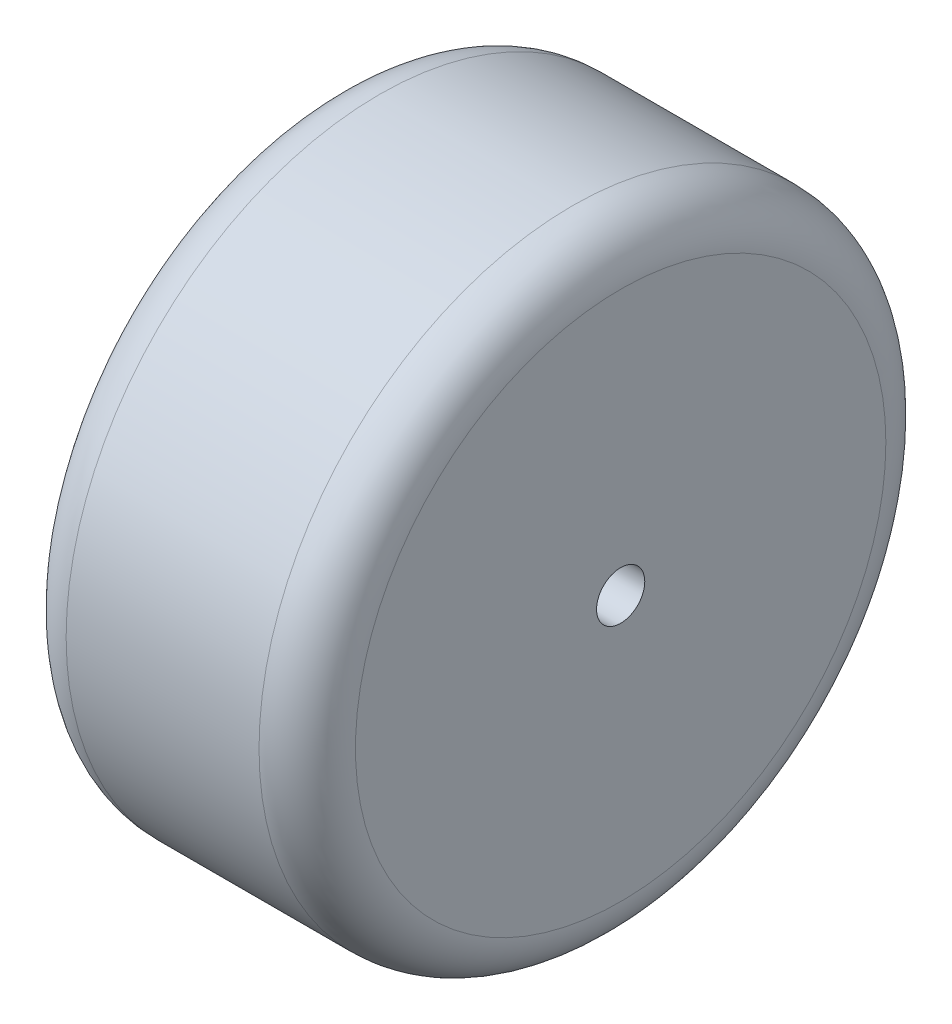
ISO-10303-21;
HEADER;
FILE_DESCRIPTION(('STEP AP214'),'2;1');
FILE_NAME('part.step','',(''),(''),'','','');
FILE_SCHEMA(('AUTOMOTIVE_DESIGN { 1 0 10303 214 1 1 1 1 }'));
ENDSEC;
DATA;
#1=APPLICATION_CONTEXT('core data for automotive mechanical design processes');
#2=APPLICATION_PROTOCOL_DEFINITION('international standard','automotive_design',2000,#1);
#3=PRODUCT_CONTEXT('',#1,'mechanical');
#4=PRODUCT('Part','Part','',(#3));
#5=PRODUCT_RELATED_PRODUCT_CATEGORY('part','',(#4));
#6=PRODUCT_DEFINITION_FORMATION('','',#4);
#7=PRODUCT_DEFINITION_CONTEXT('part definition',#1,'design');
#8=PRODUCT_DEFINITION('design','',#6,#7);
#9=PRODUCT_DEFINITION_SHAPE('','',#8);
#10=(LENGTH_UNIT() NAMED_UNIT(*) SI_UNIT(.MILLI.,.METRE.));
#11=(NAMED_UNIT(*) PLANE_ANGLE_UNIT() SI_UNIT($,.RADIAN.));
#12=(NAMED_UNIT(*) SI_UNIT($,.STERADIAN.) SOLID_ANGLE_UNIT());
#13=UNCERTAINTY_MEASURE_WITH_UNIT(LENGTH_MEASURE(1.E-05),#10,'distance_accuracy_value','');
#14=(GEOMETRIC_REPRESENTATION_CONTEXT(3) GLOBAL_UNCERTAINTY_ASSIGNED_CONTEXT((#13)) GLOBAL_UNIT_ASSIGNED_CONTEXT((#10,
#11,#12)) REPRESENTATION_CONTEXT('',''));
#15=CARTESIAN_POINT('',(0.,0.,0.));
#16=DIRECTION('',(0.,0.,1.));
#17=DIRECTION('',(1.,0.,0.));
#18=AXIS2_PLACEMENT_3D('',#15,#16,#17);
#19=CARTESIAN_POINT('',(30.,0.,0.));
#20=DIRECTION('',(1.,0.,0.));
#21=DIRECTION('',(0.,0.,-1.));
#22=AXIS2_PLACEMENT_3D('',#19,#20,#21);
#23=PLANE('',#22);
#24=CARTESIAN_POINT('',(30.,0.,0.));
#25=DIRECTION('',(1.,0.,0.));
#26=DIRECTION('',(0.,0.,-1.));
#27=AXIS2_PLACEMENT_3D('',#24,#25,#26);
#28=CIRCLE('',#27,27.5);
#29=CARTESIAN_POINT('',(30.,0.,-27.5));
#30=VERTEX_POINT('',#29);
#31=EDGE_CURVE('E10',#30,#30,#28,.T.);
#32=ORIENTED_EDGE('',*,*,#31,.T.);
#33=EDGE_LOOP('',(#32));
#34=FACE_BOUND('',#33,.T.);
#35=CARTESIAN_POINT('',(30.,0.,0.));
#36=DIRECTION('',(1.,0.,0.));
#37=DIRECTION('',(0.,0.,-1.));
#38=AXIS2_PLACEMENT_3D('',#35,#36,#37);
#39=CIRCLE('',#38,2.5);
#40=CARTESIAN_POINT('',(30.,0.,-2.5));
#41=VERTEX_POINT('',#40);
#42=EDGE_CURVE('E51',#41,#41,#39,.T.);
#43=ORIENTED_EDGE('',*,*,#42,.F.);
#44=EDGE_LOOP('',(#43));
#45=FACE_BOUND('',#44,.T.);
#46=ADVANCED_FACE('F31',(#34,#45),#23,.T.);
#47=CARTESIAN_POINT('',(0.,0.,0.));
#48=DIRECTION('',(1.,0.,0.));
#49=DIRECTION('',(0.,0.,-1.));
#50=AXIS2_PLACEMENT_3D('',#47,#48,#49);
#51=PLANE('',#50);
#52=CARTESIAN_POINT('',(0.,0.,0.));
#53=DIRECTION('',(1.,0.,0.));
#54=DIRECTION('',(0.,0.,-1.));
#55=AXIS2_PLACEMENT_3D('',#52,#53,#54);
#56=CIRCLE('',#55,27.5);
#57=CARTESIAN_POINT('',(0.,0.,-27.5));
#58=VERTEX_POINT('',#57);
#59=EDGE_CURVE('E38',#58,#58,#56,.F.);
#60=ORIENTED_EDGE('',*,*,#59,.T.);
#61=EDGE_LOOP('',(#60));
#62=FACE_BOUND('',#61,.T.);
#63=CARTESIAN_POINT('',(0.,0.,0.));
#64=DIRECTION('',(1.,0.,0.));
#65=DIRECTION('',(0.,0.,-1.));
#66=AXIS2_PLACEMENT_3D('',#63,#64,#65);
#67=CIRCLE('',#66,2.5);
#68=CARTESIAN_POINT('',(0.,0.,-2.5));
#69=VERTEX_POINT('',#68);
#70=EDGE_CURVE('E52',#69,#69,#67,.T.);
#71=ORIENTED_EDGE('',*,*,#70,.T.);
#72=EDGE_LOOP('',(#71));
#73=FACE_BOUND('',#72,.T.);
#74=ADVANCED_FACE('F62',(#62,#73),#51,.F.);
#75=CARTESIAN_POINT('',(30.,0.,0.));
#76=DIRECTION('',(-1.,0.,0.));
#77=DIRECTION('',(0.,0.,1.));
#78=AXIS2_PLACEMENT_3D('',#75,#76,#77);
#79=CYLINDRICAL_SURFACE('',#78,32.5);
#80=CARTESIAN_POINT('',(5.,0.,0.));
#81=DIRECTION('',(1.,0.,0.));
#82=DIRECTION('',(0.,0.,-1.));
#83=AXIS2_PLACEMENT_3D('',#80,#81,#82);
#84=CIRCLE('',#83,32.5);
#85=CARTESIAN_POINT('',(5.,0.,-32.5));
#86=VERTEX_POINT('',#85);
#87=EDGE_CURVE('E42',#86,#86,#84,.T.);
#88=ORIENTED_EDGE('',*,*,#87,.T.);
#89=EDGE_LOOP('',(#88));
#90=FACE_BOUND('',#89,.T.);
#91=CARTESIAN_POINT('',(25.,0.,0.));
#92=DIRECTION('',(1.,0.,0.));
#93=DIRECTION('',(0.,0.,-1.));
#94=AXIS2_PLACEMENT_3D('',#91,#92,#93);
#95=CIRCLE('',#94,32.5);
#96=CARTESIAN_POINT('',(25.,0.,-32.5));
#97=VERTEX_POINT('',#96);
#98=EDGE_CURVE('E46',#97,#97,#95,.F.);
#99=ORIENTED_EDGE('',*,*,#98,.T.);
#100=EDGE_LOOP('',(#99));
#101=FACE_BOUND('',#100,.T.);
#102=ADVANCED_FACE('F67',(#90,#101),#79,.T.);
#103=CARTESIAN_POINT('',(30.,0.,0.));
#104=DIRECTION('',(-1.,0.,0.));
#105=DIRECTION('',(0.,0.,1.));
#106=AXIS2_PLACEMENT_3D('',#103,#104,#105);
#107=CYLINDRICAL_SURFACE('',#106,2.5);
#108=ORIENTED_EDGE('',*,*,#42,.T.);
#109=EDGE_LOOP('',(#108));
#110=FACE_BOUND('',#109,.T.);
#111=ORIENTED_EDGE('',*,*,#70,.F.);
#112=EDGE_LOOP('',(#111));
#113=FACE_BOUND('',#112,.T.);
#114=ADVANCED_FACE('F58',(#110,#113),#107,.F.);
#115=CARTESIAN_POINT('',(5.,0.,0.));
#116=DIRECTION('',(1.,0.,0.));
#117=DIRECTION('',(0.,0.,-1.));
#118=AXIS2_PLACEMENT_3D('',#115,#116,#117);
#119=TOROIDAL_SURFACE('',#118,27.5,5.);
#120=ORIENTED_EDGE('',*,*,#59,.F.);
#121=EDGE_LOOP('',(#120));
#122=FACE_BOUND('',#121,.T.);
#123=ORIENTED_EDGE('',*,*,#87,.F.);
#124=EDGE_LOOP('',(#123));
#125=FACE_BOUND('',#124,.T.);
#126=ADVANCED_FACE('F73',(#122,#125),#119,.T.);
#127=CARTESIAN_POINT('',(25.,0.,0.));
#128=DIRECTION('',(1.,0.,0.));
#129=DIRECTION('',(0.,0.,-1.));
#130=AXIS2_PLACEMENT_3D('',#127,#128,#129);
#131=TOROIDAL_SURFACE('',#130,27.5,5.);
#132=ORIENTED_EDGE('',*,*,#98,.F.);
#133=EDGE_LOOP('',(#132));
#134=FACE_BOUND('',#133,.T.);
#135=ORIENTED_EDGE('',*,*,#31,.F.);
#136=EDGE_LOOP('',(#135));
#137=FACE_BOUND('',#136,.T.);
#138=ADVANCED_FACE('F33',(#134,#137),#131,.T.);
#139=CLOSED_SHELL('',(#46,#74,#102,#114,#126,#138));
#140=MANIFOLD_SOLID_BREP('B2',#139);
#141=ADVANCED_BREP_SHAPE_REPRESENTATION('',(#18,#140),#14);
#142=SHAPE_DEFINITION_REPRESENTATION(#9,#141);
ENDSEC;
END-ISO-10303-21;
